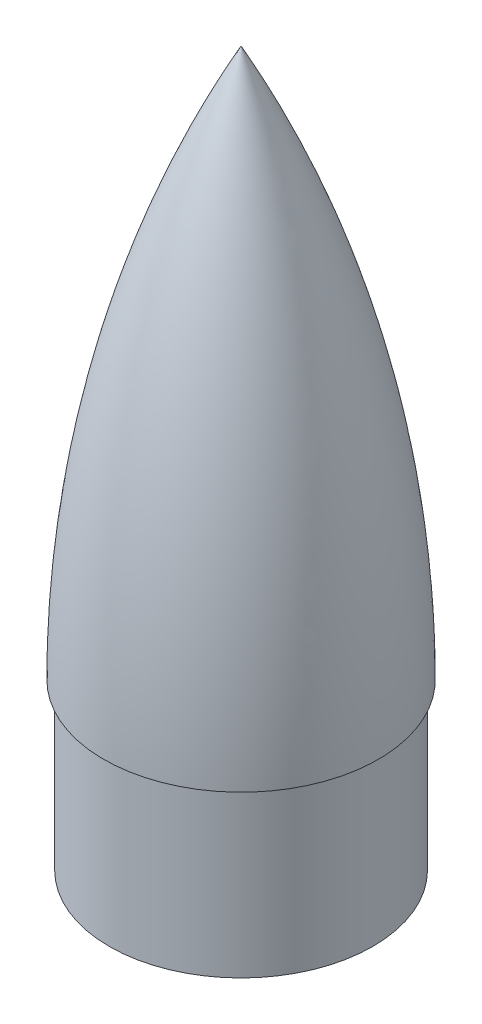
ISO-10303-21;
HEADER;
FILE_DESCRIPTION(('STEP AP214'),'2;1');
FILE_NAME('part.step','',(''),(''),'','','');
FILE_SCHEMA(('AUTOMOTIVE_DESIGN { 1 0 10303 214 1 1 1 1 }'));
ENDSEC;
DATA;
#1=APPLICATION_CONTEXT('core data for automotive mechanical design processes');
#2=APPLICATION_PROTOCOL_DEFINITION('international standard','automotive_design',2000,#1);
#3=PRODUCT_CONTEXT('',#1,'mechanical');
#4=PRODUCT('Part','Part','',(#3));
#5=PRODUCT_RELATED_PRODUCT_CATEGORY('part','',(#4));
#6=PRODUCT_DEFINITION_FORMATION('','',#4);
#7=PRODUCT_DEFINITION_CONTEXT('part definition',#1,'design');
#8=PRODUCT_DEFINITION('design','',#6,#7);
#9=PRODUCT_DEFINITION_SHAPE('','',#8);
#10=(LENGTH_UNIT() NAMED_UNIT(*) SI_UNIT(.MILLI.,.METRE.));
#11=(NAMED_UNIT(*) PLANE_ANGLE_UNIT() SI_UNIT($,.RADIAN.));
#12=(NAMED_UNIT(*) SI_UNIT($,.STERADIAN.) SOLID_ANGLE_UNIT());
#13=UNCERTAINTY_MEASURE_WITH_UNIT(LENGTH_MEASURE(1.E-05),#10,'distance_accuracy_value','');
#14=(GEOMETRIC_REPRESENTATION_CONTEXT(3) GLOBAL_UNCERTAINTY_ASSIGNED_CONTEXT((#13)) GLOBAL_UNIT_ASSIGNED_CONTEXT((#10,
#11,#12)) REPRESENTATION_CONTEXT('',''));
#15=CARTESIAN_POINT('',(0.,0.,0.));
#16=DIRECTION('',(0.,0.,1.));
#17=DIRECTION('',(1.,0.,0.));
#18=AXIS2_PLACEMENT_3D('',#15,#16,#17);
#19=CARTESIAN_POINT('',(0.,100.,0.));
#20=DIRECTION('',(0.,1.,0.));
#21=DIRECTION('',(-1.,0.,0.));
#22=AXIS2_PLACEMENT_3D('',#19,#20,#21);
#23=CYLINDRICAL_SURFACE('',#22,24.);
#24=CARTESIAN_POINT('',(0.,-30.,0.));
#25=DIRECTION('',(0.,1.,0.));
#26=DIRECTION('',(-1.,0.,0.));
#27=AXIS2_PLACEMENT_3D('',#24,#25,#26);
#28=CIRCLE('',#27,24.);
#29=CARTESIAN_POINT('',(-24.,-30.,0.));
#30=VERTEX_POINT('',#29);
#31=EDGE_CURVE('E11',#30,#30,#28,.T.);
#32=ORIENTED_EDGE('',*,*,#31,.T.);
#33=EDGE_LOOP('',(#32));
#34=FACE_BOUND('',#33,.T.);
#35=CARTESIAN_POINT('',(0.,0.,0.));
#36=DIRECTION('',(0.,1.,0.));
#37=DIRECTION('',(-1.,0.,0.));
#38=AXIS2_PLACEMENT_3D('',#35,#36,#37);
#39=CIRCLE('',#38,24.);
#40=CARTESIAN_POINT('',(-24.,0.,0.));
#41=VERTEX_POINT('',#40);
#42=EDGE_CURVE('E76',#41,#41,#39,.T.);
#43=ORIENTED_EDGE('',*,*,#42,.F.);
#44=EDGE_LOOP('',(#43));
#45=FACE_BOUND('',#44,.T.);
#46=ADVANCED_FACE('F35',(#34,#45),#23,.T.);
#47=CARTESIAN_POINT('',(0.,-30.,0.));
#48=DIRECTION('',(0.,-1.,0.));
#49=DIRECTION('',(1.,0.,0.));
#50=AXIS2_PLACEMENT_3D('',#47,#48,#49);
#51=PLANE('',#50);
#52=CARTESIAN_POINT('',(0.,-30.,0.));
#53=DIRECTION('',(0.,-1.,0.));
#54=DIRECTION('',(1.,0.,0.));
#55=AXIS2_PLACEMENT_3D('',#52,#53,#54);
#56=CIRCLE('',#55,22.8);
#57=CARTESIAN_POINT('',(22.8,-30.,0.));
#58=VERTEX_POINT('',#57);
#59=EDGE_CURVE('E78',#58,#58,#56,.F.);
#60=ORIENTED_EDGE('',*,*,#59,.T.);
#61=EDGE_LOOP('',(#60));
#62=FACE_BOUND('',#61,.T.);
#63=ORIENTED_EDGE('',*,*,#31,.F.);
#64=EDGE_LOOP('',(#63));
#65=FACE_BOUND('',#64,.T.);
#66=ADVANCED_FACE('F65',(#62,#65),#51,.T.);
#67=CARTESIAN_POINT('',(187.5,0.,0.));
#68=DIRECTION('',(0.,0.,-1.));
#69=DIRECTION('',(-1.,0.,0.));
#70=AXIS2_PLACEMENT_3D('',#67,#68,#69);
#71=CIRCLE('',#70,212.5);
#72=TRIMMED_CURVE('',#71,(PARAMETER_VALUE(-0.489957326253728)),
(PARAMETER_VALUE(0.489957326253728)),.T.,.PARAMETER.);
#73=CARTESIAN_POINT('',(0.,0.,0.));
#74=DIRECTION('',(0.,1.,0.));
#75=AXIS1_PLACEMENT('',#73,#74);
#76=SURFACE_OF_REVOLUTION('',#72,#75);
#77=CARTESIAN_POINT('',(0.,0.,0.));
#78=DIRECTION('',(0.,1.,0.));
#79=DIRECTION('',(-1.,0.,0.));
#80=AXIS2_PLACEMENT_3D('',#77,#78,#79);
#81=CIRCLE('',#80,25.);
#82=CARTESIAN_POINT('',(-25.,0.,0.));
#83=VERTEX_POINT('',#82);
#84=EDGE_CURVE('E42',#83,#83,#81,.T.);
#85=ORIENTED_EDGE('',*,*,#84,.T.);
#86=EDGE_LOOP('',(#85));
#87=FACE_BOUND('',#86,.T.);
#88=CARTESIAN_POINT('',(0.,100.,0.));
#89=VERTEX_POINT('',#88);
#90=VERTEX_LOOP('',#89);
#91=FACE_BOUND('',#90,.T.);
#92=ADVANCED_FACE('F70',(#87,#91),#76,.T.);
#93=CARTESIAN_POINT('',(-25.,0.,0.));
#94=DIRECTION('',(0.,-1.,0.));
#95=DIRECTION('',(1.,0.,0.));
#96=AXIS2_PLACEMENT_3D('',#93,#94,#95);
#97=PLANE('',#96);
#98=ORIENTED_EDGE('',*,*,#42,.T.);
#99=EDGE_LOOP('',(#98));
#100=FACE_BOUND('',#99,.T.);
#101=ORIENTED_EDGE('',*,*,#84,.F.);
#102=EDGE_LOOP('',(#101));
#103=FACE_BOUND('',#102,.T.);
#104=ADVANCED_FACE('F60',(#100,#103),#97,.T.);
#105=CARTESIAN_POINT('',(0.,100.,0.));
#106=DIRECTION('',(0.,1.,0.));
#107=DIRECTION('',(-1.,0.,0.));
#108=AXIS2_PLACEMENT_3D('',#105,#106,#107);
#109=CYLINDRICAL_SURFACE('',#108,22.8);
#110=ORIENTED_EDGE('',*,*,#59,.F.);
#111=EDGE_LOOP('',(#110));
#112=FACE_BOUND('',#111,.T.);
#113=CARTESIAN_POINT('',(0.,1.20000000000001,0.));
#114=DIRECTION('',(0.,-1.,0.));
#115=DIRECTION('',(1.,0.,0.));
#116=AXIS2_PLACEMENT_3D('',#113,#114,#115);
#117=CIRCLE('',#116,22.8);
#118=CARTESIAN_POINT('',(22.8,1.20000000000001,0.));
#119=VERTEX_POINT('',#118);
#120=EDGE_CURVE('E87',#119,#119,#117,.F.);
#121=ORIENTED_EDGE('',*,*,#120,.T.);
#122=EDGE_LOOP('',(#121));
#123=FACE_BOUND('',#122,.T.);
#124=ADVANCED_FACE('F51',(#112,#123),#109,.F.);
#125=CARTESIAN_POINT('',(187.5,0.,0.));
#126=DIRECTION('',(0.,0.,-1.));
#127=DIRECTION('',(-1.,0.,0.));
#128=AXIS2_PLACEMENT_3D('',#125,#126,#127);
#129=CIRCLE('',#128,211.3);
#130=TRIMMED_CURVE('',#129,(PARAMETER_VALUE(-0.479200270484947)),
(PARAMETER_VALUE(0.479200270484947)),.T.,.PARAMETER.);
#131=CARTESIAN_POINT('',(0.,0.,0.));
#132=DIRECTION('',(0.,1.,0.));
#133=AXIS1_PLACEMENT('',#131,#132);
#134=SURFACE_OF_REVOLUTION('',#130,#133);
#135=CARTESIAN_POINT('',(0.,1.2,0.));
#136=DIRECTION('',(0.,-1.,0.));
#137=DIRECTION('',(1.,0.,0.));
#138=AXIS2_PLACEMENT_3D('',#135,#136,#137);
#139=CIRCLE('',#138,23.7965924950045);
#140=CARTESIAN_POINT('',(23.7965924950045,1.20000000000001,0.));
#141=VERTEX_POINT('',#140);
#142=EDGE_CURVE('E82',#141,#141,#139,.F.);
#143=ORIENTED_EDGE('',*,*,#142,.F.);
#144=EDGE_LOOP('',(#143));
#145=FACE_BOUND('',#144,.T.);
#146=CARTESIAN_POINT('',(0.,97.424021678434,0.));
#147=VERTEX_POINT('',#146);
#148=VERTEX_LOOP('',#147);
#149=FACE_BOUND('',#148,.T.);
#150=ADVANCED_FACE('F48',(#145,#149),#134,.F.);
#151=CARTESIAN_POINT('',(-25.,1.2,0.));
#152=DIRECTION('',(0.,-1.,0.));
#153=DIRECTION('',(1.,0.,0.));
#154=AXIS2_PLACEMENT_3D('',#151,#152,#153);
#155=PLANE('',#154);
#156=ORIENTED_EDGE('',*,*,#120,.F.);
#157=EDGE_LOOP('',(#156));
#158=FACE_BOUND('',#157,.T.);
#159=ORIENTED_EDGE('',*,*,#142,.T.);
#160=EDGE_LOOP('',(#159));
#161=FACE_BOUND('',#160,.T.);
#162=ADVANCED_FACE('F50',(#158,#161),#155,.F.);
#163=CLOSED_SHELL('',(#46,#66,#92,#104,#124,#150,#162));
#164=MANIFOLD_SOLID_BREP('B2',#163);
#165=ADVANCED_BREP_SHAPE_REPRESENTATION('',(#18,#164),#14);
#166=SHAPE_DEFINITION_REPRESENTATION(#9,#165);
ENDSEC;
END-ISO-10303-21;
